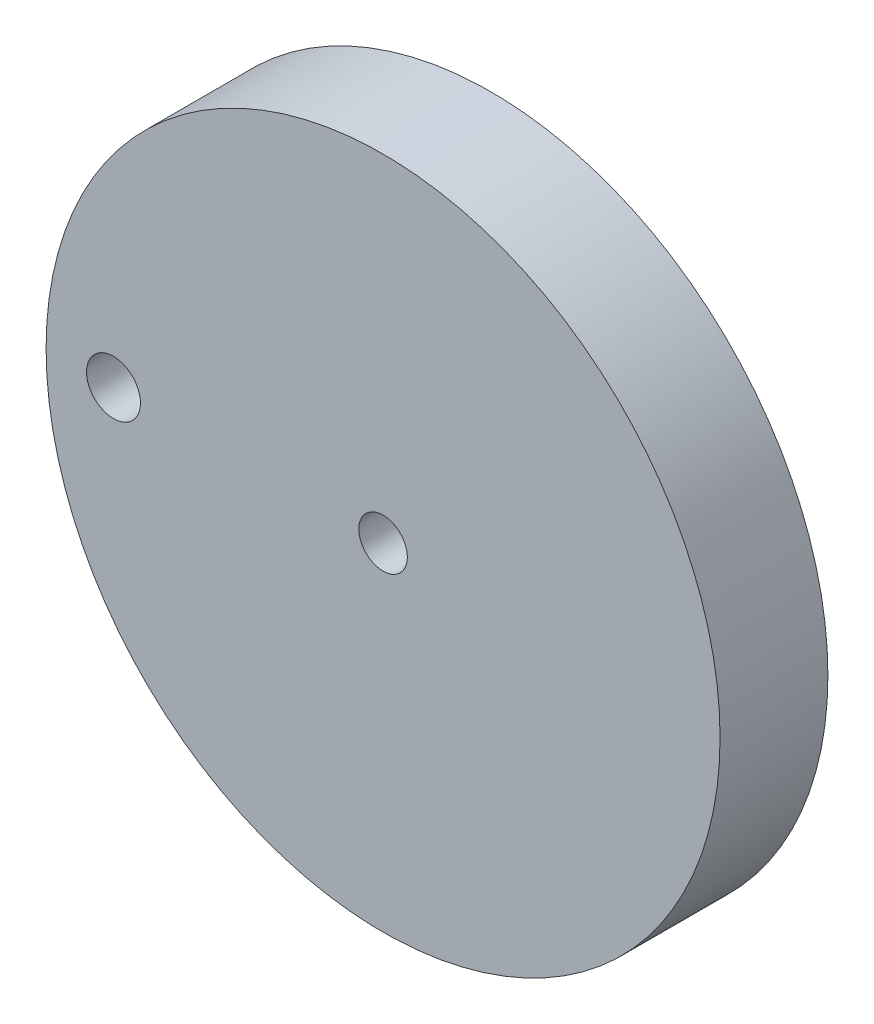
ISO-10303-21;
HEADER;
FILE_DESCRIPTION(('STEP AP214'),'2;1');
FILE_NAME('part.step','',(''),(''),'','','');
FILE_SCHEMA(('AUTOMOTIVE_DESIGN { 1 0 10303 214 1 1 1 1 }'));
ENDSEC;
DATA;
#1=APPLICATION_CONTEXT('core data for automotive mechanical design processes');
#2=APPLICATION_PROTOCOL_DEFINITION('international standard','automotive_design',2000,#1);
#3=PRODUCT_CONTEXT('',#1,'mechanical');
#4=PRODUCT('Part','Part','',(#3));
#5=PRODUCT_RELATED_PRODUCT_CATEGORY('part','',(#4));
#6=PRODUCT_DEFINITION_FORMATION('','',#4);
#7=PRODUCT_DEFINITION_CONTEXT('part definition',#1,'design');
#8=PRODUCT_DEFINITION('design','',#6,#7);
#9=PRODUCT_DEFINITION_SHAPE('','',#8);
#10=(LENGTH_UNIT() NAMED_UNIT(*) SI_UNIT(.MILLI.,.METRE.));
#11=(NAMED_UNIT(*) PLANE_ANGLE_UNIT() SI_UNIT($,.RADIAN.));
#12=(NAMED_UNIT(*) SI_UNIT($,.STERADIAN.) SOLID_ANGLE_UNIT());
#13=UNCERTAINTY_MEASURE_WITH_UNIT(LENGTH_MEASURE(1.E-05),#10,'distance_accuracy_value','');
#14=(GEOMETRIC_REPRESENTATION_CONTEXT(3) GLOBAL_UNCERTAINTY_ASSIGNED_CONTEXT((#13)) GLOBAL_UNIT_ASSIGNED_CONTEXT((#10,
#11,#12)) REPRESENTATION_CONTEXT('',''));
#15=CARTESIAN_POINT('',(0.,0.,0.));
#16=DIRECTION('',(0.,0.,1.));
#17=DIRECTION('',(1.,0.,0.));
#18=AXIS2_PLACEMENT_3D('',#15,#16,#17);
#19=CARTESIAN_POINT('',(-10.,0.,4.));
#20=DIRECTION('',(0.,0.,-1.));
#21=DIRECTION('',(-1.,0.,0.));
#22=AXIS2_PLACEMENT_3D('',#19,#20,#21);
#23=CYLINDRICAL_SURFACE('',#22,1.);
#24=CARTESIAN_POINT('',(-10.,0.,4.));
#25=DIRECTION('',(0.,0.,1.));
#26=DIRECTION('',(1.,0.,0.));
#27=AXIS2_PLACEMENT_3D('',#24,#25,#26);
#28=CIRCLE('',#27,1.);
#29=CARTESIAN_POINT('',(-9.,0.,4.));
#30=VERTEX_POINT('',#29);
#31=EDGE_CURVE('E46',#30,#30,#28,.T.);
#32=ORIENTED_EDGE('',*,*,#31,.T.);
#33=EDGE_LOOP('',(#32));
#34=FACE_BOUND('',#33,.T.);
#35=CARTESIAN_POINT('',(-10.,0.,0.));
#36=DIRECTION('',(0.,0.,1.));
#37=DIRECTION('',(1.,0.,0.));
#38=AXIS2_PLACEMENT_3D('',#35,#36,#37);
#39=CIRCLE('',#38,1.);
#40=CARTESIAN_POINT('',(-9.,0.,0.));
#41=VERTEX_POINT('',#40);
#42=EDGE_CURVE('E59',#41,#41,#39,.T.);
#43=ORIENTED_EDGE('',*,*,#42,.F.);
#44=EDGE_LOOP('',(#43));
#45=FACE_BOUND('',#44,.T.);
#46=ADVANCED_FACE('F37',(#34,#45),#23,.F.);
#47=CARTESIAN_POINT('',(0.,0.,4.));
#48=DIRECTION('',(0.,0.,-1.));
#49=DIRECTION('',(-1.,0.,0.));
#50=AXIS2_PLACEMENT_3D('',#47,#48,#49);
#51=CYLINDRICAL_SURFACE('',#50,0.9);
#52=CARTESIAN_POINT('',(0.,0.,4.));
#53=DIRECTION('',(0.,0.,1.));
#54=DIRECTION('',(1.,0.,0.));
#55=AXIS2_PLACEMENT_3D('',#52,#53,#54);
#56=CIRCLE('',#55,0.9);
#57=CARTESIAN_POINT('',(0.9,0.,4.));
#58=VERTEX_POINT('',#57);
#59=EDGE_CURVE('E52',#58,#58,#56,.T.);
#60=ORIENTED_EDGE('',*,*,#59,.T.);
#61=EDGE_LOOP('',(#60));
#62=FACE_BOUND('',#61,.T.);
#63=CARTESIAN_POINT('',(0.,0.,0.));
#64=DIRECTION('',(0.,0.,1.));
#65=DIRECTION('',(1.,0.,0.));
#66=AXIS2_PLACEMENT_3D('',#63,#64,#65);
#67=CIRCLE('',#66,0.9);
#68=CARTESIAN_POINT('',(0.9,0.,0.));
#69=VERTEX_POINT('',#68);
#70=EDGE_CURVE('E56',#69,#69,#67,.T.);
#71=ORIENTED_EDGE('',*,*,#70,.F.);
#72=EDGE_LOOP('',(#71));
#73=FACE_BOUND('',#72,.T.);
#74=ADVANCED_FACE('F39',(#62,#73),#51,.F.);
#75=CARTESIAN_POINT('',(0.,0.,4.));
#76=DIRECTION('',(0.,0.,-1.));
#77=DIRECTION('',(-1.,0.,0.));
#78=AXIS2_PLACEMENT_3D('',#75,#76,#77);
#79=CYLINDRICAL_SURFACE('',#78,12.5);
#80=CARTESIAN_POINT('',(0.,0.,4.));
#81=DIRECTION('',(0.,0.,1.));
#82=DIRECTION('',(1.,0.,0.));
#83=AXIS2_PLACEMENT_3D('',#80,#81,#82);
#84=CIRCLE('',#83,12.5);
#85=CARTESIAN_POINT('',(12.5,0.,4.));
#86=VERTEX_POINT('',#85);
#87=EDGE_CURVE('E10',#86,#86,#84,.T.);
#88=ORIENTED_EDGE('',*,*,#87,.F.);
#89=EDGE_LOOP('',(#88));
#90=FACE_BOUND('',#89,.T.);
#91=CARTESIAN_POINT('',(0.,0.,0.));
#92=DIRECTION('',(0.,0.,1.));
#93=DIRECTION('',(1.,0.,0.));
#94=AXIS2_PLACEMENT_3D('',#91,#92,#93);
#95=CIRCLE('',#94,12.5);
#96=CARTESIAN_POINT('',(12.5,0.,0.));
#97=VERTEX_POINT('',#96);
#98=EDGE_CURVE('E41',#97,#97,#95,.T.);
#99=ORIENTED_EDGE('',*,*,#98,.T.);
#100=EDGE_LOOP('',(#99));
#101=FACE_BOUND('',#100,.T.);
#102=ADVANCED_FACE('F78',(#90,#101),#79,.T.);
#103=CARTESIAN_POINT('',(0.,0.,4.));
#104=DIRECTION('',(0.,0.,1.));
#105=DIRECTION('',(1.,0.,0.));
#106=AXIS2_PLACEMENT_3D('',#103,#104,#105);
#107=PLANE('',#106);
#108=ORIENTED_EDGE('',*,*,#59,.F.);
#109=EDGE_LOOP('',(#108));
#110=FACE_BOUND('',#109,.T.);
#111=ORIENTED_EDGE('',*,*,#31,.F.);
#112=EDGE_LOOP('',(#111));
#113=FACE_BOUND('',#112,.T.);
#114=ORIENTED_EDGE('',*,*,#87,.T.);
#115=EDGE_LOOP('',(#114));
#116=FACE_BOUND('',#115,.T.);
#117=ADVANCED_FACE('F74',(#110,#113,#116),#107,.T.);
#118=CARTESIAN_POINT('',(0.,0.,0.));
#119=DIRECTION('',(0.,0.,1.));
#120=DIRECTION('',(1.,0.,0.));
#121=AXIS2_PLACEMENT_3D('',#118,#119,#120);
#122=PLANE('',#121);
#123=ORIENTED_EDGE('',*,*,#70,.T.);
#124=EDGE_LOOP('',(#123));
#125=FACE_BOUND('',#124,.T.);
#126=ORIENTED_EDGE('',*,*,#42,.T.);
#127=EDGE_LOOP('',(#126));
#128=FACE_BOUND('',#127,.T.);
#129=ORIENTED_EDGE('',*,*,#98,.F.);
#130=EDGE_LOOP('',(#129));
#131=FACE_BOUND('',#130,.T.);
#132=ADVANCED_FACE('F77',(#125,#128,#131),#122,.F.);
#133=CLOSED_SHELL('',(#46,#74,#102,#117,#132));
#134=MANIFOLD_SOLID_BREP('B2',#133);
#135=ADVANCED_BREP_SHAPE_REPRESENTATION('',(#18,#134),#14);
#136=SHAPE_DEFINITION_REPRESENTATION(#9,#135);
ENDSEC;
END-ISO-10303-21;
